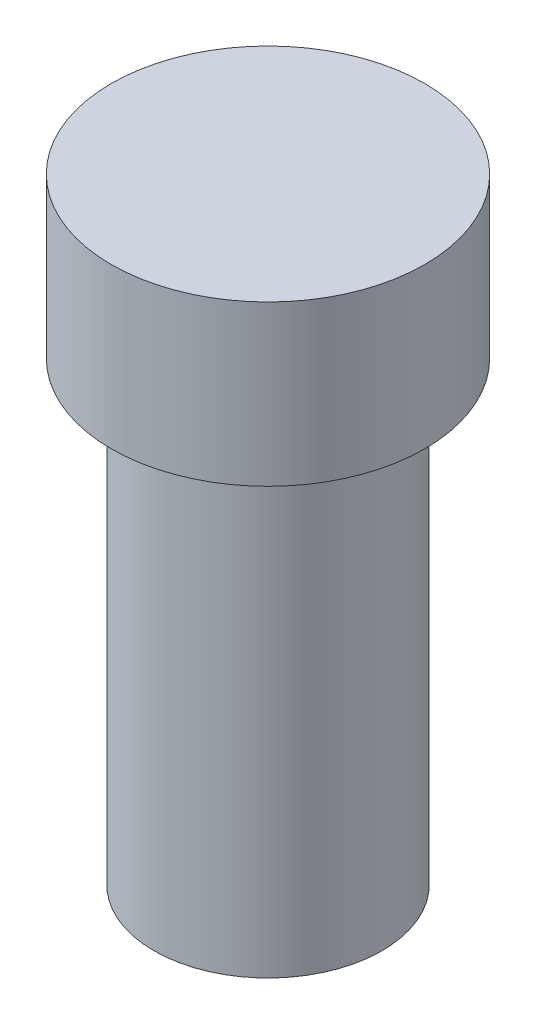
ISO-10303-21;
HEADER;
FILE_DESCRIPTION(('STEP AP214'),'2;1');
FILE_NAME('part.step','',(''),(''),'','','');
FILE_SCHEMA(('AUTOMOTIVE_DESIGN { 1 0 10303 214 1 1 1 1 }'));
ENDSEC;
DATA;
#1=APPLICATION_CONTEXT('core data for automotive mechanical design processes');
#2=APPLICATION_PROTOCOL_DEFINITION('international standard','automotive_design',2000,#1);
#3=PRODUCT_CONTEXT('',#1,'mechanical');
#4=PRODUCT('Part','Part','',(#3));
#5=PRODUCT_RELATED_PRODUCT_CATEGORY('part','',(#4));
#6=PRODUCT_DEFINITION_FORMATION('','',#4);
#7=PRODUCT_DEFINITION_CONTEXT('part definition',#1,'design');
#8=PRODUCT_DEFINITION('design','',#6,#7);
#9=PRODUCT_DEFINITION_SHAPE('','',#8);
#10=(LENGTH_UNIT() NAMED_UNIT(*) SI_UNIT(.MILLI.,.METRE.));
#11=(NAMED_UNIT(*) PLANE_ANGLE_UNIT() SI_UNIT($,.RADIAN.));
#12=(NAMED_UNIT(*) SI_UNIT($,.STERADIAN.) SOLID_ANGLE_UNIT());
#13=UNCERTAINTY_MEASURE_WITH_UNIT(LENGTH_MEASURE(1.E-05),#10,'distance_accuracy_value','');
#14=(GEOMETRIC_REPRESENTATION_CONTEXT(3) GLOBAL_UNCERTAINTY_ASSIGNED_CONTEXT((#13)) GLOBAL_UNIT_ASSIGNED_CONTEXT((#10,
#11,#12)) REPRESENTATION_CONTEXT('',''));
#15=CARTESIAN_POINT('',(0.,0.,0.));
#16=DIRECTION('',(0.,0.,1.));
#17=DIRECTION('',(1.,0.,0.));
#18=AXIS2_PLACEMENT_3D('',#15,#16,#17);
#19=CARTESIAN_POINT('',(0.,2.8,0.));
#20=DIRECTION('',(0.,-1.,0.));
#21=DIRECTION('',(0.,0.,-1.));
#22=AXIS2_PLACEMENT_3D('',#19,#20,#21);
#23=CYLINDRICAL_SURFACE('',#22,2.75);
#24=CARTESIAN_POINT('',(0.,2.8,0.));
#25=DIRECTION('',(0.,1.,0.));
#26=DIRECTION('',(0.,0.,1.));
#27=AXIS2_PLACEMENT_3D('',#24,#25,#26);
#28=CIRCLE('',#27,2.75);
#29=CARTESIAN_POINT('',(0.,2.8,2.75));
#30=VERTEX_POINT('',#29);
#31=EDGE_CURVE('E10',#30,#30,#28,.T.);
#32=ORIENTED_EDGE('',*,*,#31,.F.);
#33=EDGE_LOOP('',(#32));
#34=FACE_BOUND('',#33,.T.);
#35=CARTESIAN_POINT('',(0.,0.,0.));
#36=DIRECTION('',(0.,1.,0.));
#37=DIRECTION('',(0.,0.,1.));
#38=AXIS2_PLACEMENT_3D('',#35,#36,#37);
#39=CIRCLE('',#38,2.75);
#40=CARTESIAN_POINT('',(0.,0.,2.75));
#41=VERTEX_POINT('',#40);
#42=EDGE_CURVE('E34',#41,#41,#39,.T.);
#43=ORIENTED_EDGE('',*,*,#42,.T.);
#44=EDGE_LOOP('',(#43));
#45=FACE_BOUND('',#44,.T.);
#46=ADVANCED_FACE('F31',(#34,#45),#23,.T.);
#47=CARTESIAN_POINT('',(0.,2.8,0.));
#48=DIRECTION('',(0.,1.,0.));
#49=DIRECTION('',(0.,0.,1.));
#50=AXIS2_PLACEMENT_3D('',#47,#48,#49);
#51=PLANE('',#50);
#52=ORIENTED_EDGE('',*,*,#31,.T.);
#53=EDGE_LOOP('',(#52));
#54=FACE_BOUND('',#53,.T.);
#55=ADVANCED_FACE('F61',(#54),#51,.T.);
#56=CARTESIAN_POINT('',(0.,0.,0.));
#57=DIRECTION('',(0.,1.,0.));
#58=DIRECTION('',(0.,0.,1.));
#59=AXIS2_PLACEMENT_3D('',#56,#57,#58);
#60=PLANE('',#59);
#61=CARTESIAN_POINT('',(0.,0.,0.));
#62=DIRECTION('',(0.,1.,0.));
#63=DIRECTION('',(0.,0.,1.));
#64=AXIS2_PLACEMENT_3D('',#61,#62,#63);
#65=CIRCLE('',#64,2.);
#66=CARTESIAN_POINT('',(0.,0.,2.));
#67=VERTEX_POINT('',#66);
#68=EDGE_CURVE('E43',#67,#67,#65,.T.);
#69=ORIENTED_EDGE('',*,*,#68,.T.);
#70=EDGE_LOOP('',(#69));
#71=FACE_BOUND('',#70,.T.);
#72=ORIENTED_EDGE('',*,*,#42,.F.);
#73=EDGE_LOOP('',(#72));
#74=FACE_BOUND('',#73,.T.);
#75=ADVANCED_FACE('F58',(#71,#74),#60,.F.);
#76=CARTESIAN_POINT('',(0.,-8.,0.));
#77=DIRECTION('',(0.,1.,0.));
#78=DIRECTION('',(0.,0.,1.));
#79=AXIS2_PLACEMENT_3D('',#76,#77,#78);
#80=CYLINDRICAL_SURFACE('',#79,2.);
#81=CARTESIAN_POINT('',(0.,-8.,0.));
#82=DIRECTION('',(0.,1.,0.));
#83=DIRECTION('',(0.,0.,1.));
#84=AXIS2_PLACEMENT_3D('',#81,#82,#83);
#85=CIRCLE('',#84,2.);
#86=CARTESIAN_POINT('',(0.,-8.,2.));
#87=VERTEX_POINT('',#86);
#88=EDGE_CURVE('E41',#87,#87,#85,.T.);
#89=ORIENTED_EDGE('',*,*,#88,.T.);
#90=EDGE_LOOP('',(#89));
#91=FACE_BOUND('',#90,.T.);
#92=ORIENTED_EDGE('',*,*,#68,.F.);
#93=EDGE_LOOP('',(#92));
#94=FACE_BOUND('',#93,.T.);
#95=ADVANCED_FACE('F49',(#91,#94),#80,.T.);
#96=CARTESIAN_POINT('',(0.,-8.,0.));
#97=DIRECTION('',(0.,1.,0.));
#98=DIRECTION('',(0.,0.,1.));
#99=AXIS2_PLACEMENT_3D('',#96,#97,#98);
#100=PLANE('',#99);
#101=ORIENTED_EDGE('',*,*,#88,.F.);
#102=EDGE_LOOP('',(#101));
#103=FACE_BOUND('',#102,.T.);
#104=ADVANCED_FACE('F52',(#103),#100,.F.);
#105=CLOSED_SHELL('',(#46,#55,#75,#95,#104));
#106=MANIFOLD_SOLID_BREP('B2',#105);
#107=ADVANCED_BREP_SHAPE_REPRESENTATION('',(#18,#106),#14);
#108=SHAPE_DEFINITION_REPRESENTATION(#9,#107);
ENDSEC;
END-ISO-10303-21;
